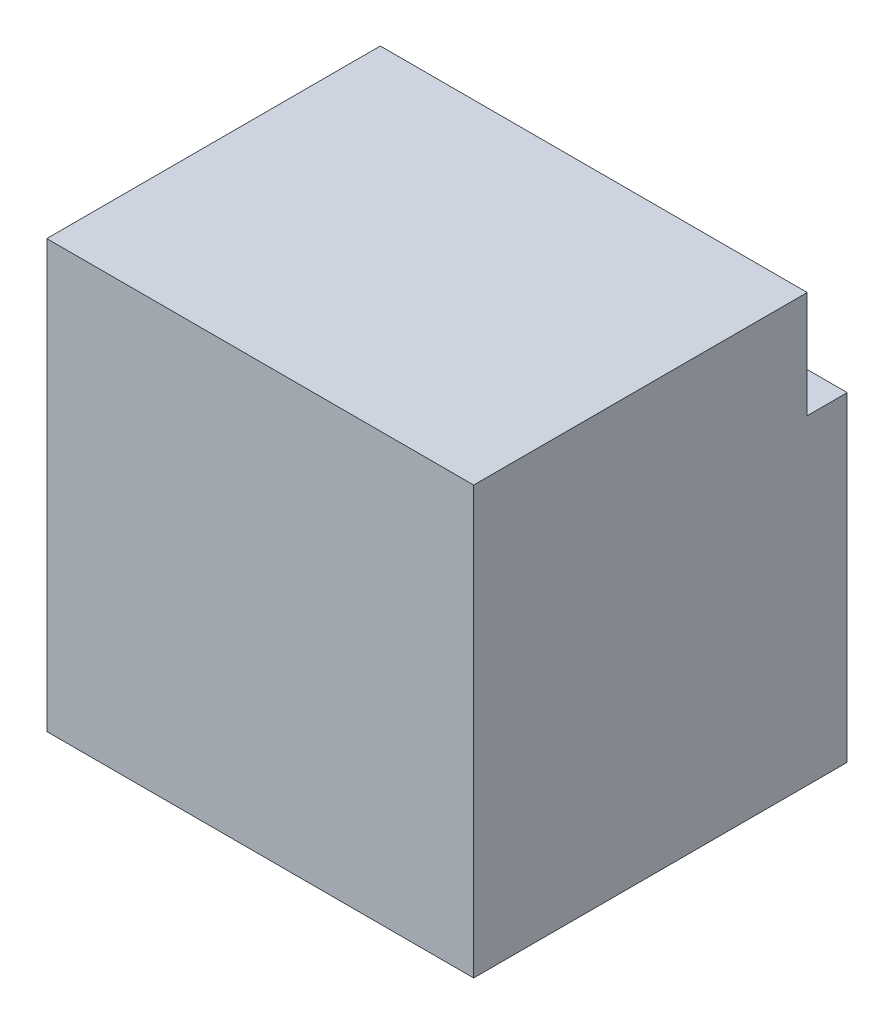
ISO-10303-21;
HEADER;
FILE_DESCRIPTION(('STEP AP214'),'2;1');
FILE_NAME('part.step','',(''),(''),'','','');
FILE_SCHEMA(('AUTOMOTIVE_DESIGN { 1 0 10303 214 1 1 1 1 }'));
ENDSEC;
DATA;
#1=APPLICATION_CONTEXT('core data for automotive mechanical design processes');
#2=APPLICATION_PROTOCOL_DEFINITION('international standard','automotive_design',2000,#1);
#3=PRODUCT_CONTEXT('',#1,'mechanical');
#4=PRODUCT('Part','Part','',(#3));
#5=PRODUCT_RELATED_PRODUCT_CATEGORY('part','',(#4));
#6=PRODUCT_DEFINITION_FORMATION('','',#4);
#7=PRODUCT_DEFINITION_CONTEXT('part definition',#1,'design');
#8=PRODUCT_DEFINITION('design','',#6,#7);
#9=PRODUCT_DEFINITION_SHAPE('','',#8);
#10=(LENGTH_UNIT() NAMED_UNIT(*) SI_UNIT(.MILLI.,.METRE.));
#11=(NAMED_UNIT(*) PLANE_ANGLE_UNIT() SI_UNIT($,.RADIAN.));
#12=(NAMED_UNIT(*) SI_UNIT($,.STERADIAN.) SOLID_ANGLE_UNIT());
#13=UNCERTAINTY_MEASURE_WITH_UNIT(LENGTH_MEASURE(1.E-05),#10,'distance_accuracy_value','');
#14=(GEOMETRIC_REPRESENTATION_CONTEXT(3) GLOBAL_UNCERTAINTY_ASSIGNED_CONTEXT((#13)) GLOBAL_UNIT_ASSIGNED_CONTEXT((#10,
#11,#12)) REPRESENTATION_CONTEXT('',''));
#15=CARTESIAN_POINT('',(0.,0.,0.));
#16=DIRECTION('',(0.,0.,1.));
#17=DIRECTION('',(1.,0.,0.));
#18=AXIS2_PLACEMENT_3D('',#15,#16,#17);
#19=CARTESIAN_POINT('',(-8.,8.,14.));
#20=DIRECTION('',(0.,-1.,0.));
#21=DIRECTION('',(0.,0.,-1.));
#22=AXIS2_PLACEMENT_3D('',#19,#20,#21);
#23=PLANE('',#22);
#24=DIRECTION('',(1.,0.,0.));
#25=VECTOR('',#24,1.);
#26=CARTESIAN_POINT('',(8.,8.,1.5));
#27=LINE('',#26,#25);
#28=CARTESIAN_POINT('',(-8.,8.,1.5));
#29=VERTEX_POINT('',#28);
#30=CARTESIAN_POINT('',(8.,8.,1.5));
#31=VERTEX_POINT('',#30);
#32=EDGE_CURVE('E379',#29,#31,#27,.T.);
#33=ORIENTED_EDGE('',*,*,#32,.F.);
#34=DIRECTION('',(0.,0.,-1.));
#35=VECTOR('',#34,1.);
#36=CARTESIAN_POINT('',(-8.,8.,14.));
#37=LINE('',#36,#35);
#38=CARTESIAN_POINT('',(-8.,8.,14.));
#39=VERTEX_POINT('',#38);
#40=EDGE_CURVE('E514',#39,#29,#37,.T.);
#41=ORIENTED_EDGE('',*,*,#40,.F.);
#42=DIRECTION('',(-1.,0.,0.));
#43=VECTOR('',#42,1.);
#44=CARTESIAN_POINT('',(-8.,8.,14.));
#45=LINE('',#44,#43);
#46=CARTESIAN_POINT('',(8.,8.,14.));
#47=VERTEX_POINT('',#46);
#48=EDGE_CURVE('E512',#47,#39,#45,.T.);
#49=ORIENTED_EDGE('',*,*,#48,.F.);
#50=DIRECTION('',(0.,0.,-1.));
#51=VECTOR('',#50,1.);
#52=CARTESIAN_POINT('',(8.,8.,14.));
#53=LINE('',#52,#51);
#54=EDGE_CURVE('E522',#47,#31,#53,.T.);
#55=ORIENTED_EDGE('',*,*,#54,.T.);
#56=EDGE_LOOP('',(#33,#41,#49,#55));
#57=FACE_BOUND('',#56,.T.);
#58=ADVANCED_FACE('F41',(#57),#23,.F.);
#59=CARTESIAN_POINT('',(-5.5,2.,10.));
#60=DIRECTION('',(0.,0.,1.));
#61=DIRECTION('',(1.,0.,0.));
#62=AXIS2_PLACEMENT_3D('',#59,#60,#61);
#63=PLANE('',#62);
#64=DIRECTION('',(-1.,0.,0.));
#65=VECTOR('',#64,1.);
#66=CARTESIAN_POINT('',(-5.5,2.,10.));
#67=LINE('',#66,#65);
#68=CARTESIAN_POINT('',(-3.5,2.,10.));
#69=VERTEX_POINT('',#68);
#70=CARTESIAN_POINT('',(-5.5,2.,10.));
#71=VERTEX_POINT('',#70);
#72=EDGE_CURVE('E479',#69,#71,#67,.T.);
#73=ORIENTED_EDGE('',*,*,#72,.F.);
#74=DIRECTION('',(0.,-1.,0.));
#75=VECTOR('',#74,1.);
#76=CARTESIAN_POINT('',(-3.5,2.,10.));
#77=LINE('',#76,#75);
#78=CARTESIAN_POINT('',(-3.5,-8.,10.));
#79=VERTEX_POINT('',#78);
#80=EDGE_CURVE('E453',#69,#79,#77,.T.);
#81=ORIENTED_EDGE('',*,*,#80,.T.);
#82=DIRECTION('',(-1.,0.,0.));
#83=VECTOR('',#82,1.);
#84=CARTESIAN_POINT('',(-5.5,-8.,10.));
#85=LINE('',#84,#83);
#86=CARTESIAN_POINT('',(-5.5,-8.,10.));
#87=VERTEX_POINT('',#86);
#88=EDGE_CURVE('E491',#79,#87,#85,.T.);
#89=ORIENTED_EDGE('',*,*,#88,.T.);
#90=DIRECTION('',(0.,-1.,0.));
#91=VECTOR('',#90,1.);
#92=CARTESIAN_POINT('',(-5.5,2.,10.));
#93=LINE('',#92,#91);
#94=EDGE_CURVE('E494',#71,#87,#93,.T.);
#95=ORIENTED_EDGE('',*,*,#94,.F.);
#96=EDGE_LOOP('',(#73,#81,#89,#95));
#97=FACE_BOUND('',#96,.T.);
#98=ADVANCED_FACE('F561',(#97),#63,.F.);
#99=CARTESIAN_POINT('',(-8.,8.,14.));
#100=DIRECTION('',(1.,0.,0.));
#101=DIRECTION('',(0.,1.,0.));
#102=AXIS2_PLACEMENT_3D('',#99,#100,#101);
#103=PLANE('',#102);
#104=DIRECTION('',(0.,1.,0.));
#105=VECTOR('',#104,1.);
#106=CARTESIAN_POINT('',(-8.,8.,1.5));
#107=LINE('',#106,#105);
#108=CARTESIAN_POINT('',(-8.,4.,1.5));
#109=VERTEX_POINT('',#108);
#110=EDGE_CURVE('E377',#109,#29,#107,.T.);
#111=ORIENTED_EDGE('',*,*,#110,.F.);
#112=DIRECTION('',(0.,0.,-1.));
#113=VECTOR('',#112,1.);
#114=CARTESIAN_POINT('',(-8.,4.,1.5));
#115=LINE('',#114,#113);
#116=CARTESIAN_POINT('',(-8.,4.,0.));
#117=VERTEX_POINT('',#116);
#118=EDGE_CURVE('E383',#109,#117,#115,.T.);
#119=ORIENTED_EDGE('',*,*,#118,.T.);
#120=DIRECTION('',(0.,-1.,0.));
#121=VECTOR('',#120,1.);
#122=CARTESIAN_POINT('',(-8.,8.,0.));
#123=LINE('',#122,#121);
#124=CARTESIAN_POINT('',(-8.,-8.,0.));
#125=VERTEX_POINT('',#124);
#126=EDGE_CURVE('E497',#117,#125,#123,.T.);
#127=ORIENTED_EDGE('',*,*,#126,.T.);
#128=DIRECTION('',(0.,0.,-1.));
#129=VECTOR('',#128,1.);
#130=CARTESIAN_POINT('',(-8.,-8.,14.));
#131=LINE('',#130,#129);
#132=CARTESIAN_POINT('',(-8.,-8.,14.));
#133=VERTEX_POINT('',#132);
#134=EDGE_CURVE('E11',#133,#125,#131,.T.);
#135=ORIENTED_EDGE('',*,*,#134,.F.);
#136=DIRECTION('',(0.,-1.,0.));
#137=VECTOR('',#136,1.);
#138=CARTESIAN_POINT('',(-8.,8.,14.));
#139=LINE('',#138,#137);
#140=EDGE_CURVE('E504',#39,#133,#139,.T.);
#141=ORIENTED_EDGE('',*,*,#140,.F.);
#142=ORIENTED_EDGE('',*,*,#40,.T.);
#143=EDGE_LOOP('',(#111,#119,#127,#135,#141,#142));
#144=FACE_BOUND('',#143,.T.);
#145=ADVANCED_FACE('F43',(#144),#103,.F.);
#146=CARTESIAN_POINT('',(-8.,-8.,14.));
#147=DIRECTION('',(0.,1.,0.));
#148=DIRECTION('',(0.,0.,1.));
#149=AXIS2_PLACEMENT_3D('',#146,#147,#148);
#150=PLANE('',#149);
#151=DIRECTION('',(1.,0.,0.));
#152=VECTOR('',#151,1.);
#153=CARTESIAN_POINT('',(4.1,-8.,10.6));
#154=LINE('',#153,#152);
#155=CARTESIAN_POINT('',(4.1,-8.,10.6));
#156=VERTEX_POINT('',#155);
#157=CARTESIAN_POINT('',(6.1,-8.,10.6));
#158=VERTEX_POINT('',#157);
#159=EDGE_CURVE('E400',#156,#158,#154,.T.);
#160=ORIENTED_EDGE('',*,*,#159,.F.);
#161=DIRECTION('',(0.,0.,-1.));
#162=VECTOR('',#161,1.);
#163=CARTESIAN_POINT('',(4.1,-8.,12.2));
#164=LINE('',#163,#162);
#165=CARTESIAN_POINT('',(4.1,-8.,12.2));
#166=VERTEX_POINT('',#165);
#167=EDGE_CURVE('E398',#166,#156,#164,.T.);
#168=ORIENTED_EDGE('',*,*,#167,.F.);
#169=DIRECTION('',(-1.,0.,0.));
#170=VECTOR('',#169,1.);
#171=CARTESIAN_POINT('',(4.1,-8.,12.2));
#172=LINE('',#171,#170);
#173=CARTESIAN_POINT('',(6.1,-8.,12.2));
#174=VERTEX_POINT('',#173);
#175=EDGE_CURVE('E392',#174,#166,#172,.T.);
#176=ORIENTED_EDGE('',*,*,#175,.F.);
#177=DIRECTION('',(0.,0.,1.));
#178=VECTOR('',#177,1.);
#179=CARTESIAN_POINT('',(6.1,-8.,12.2));
#180=LINE('',#179,#178);
#181=EDGE_CURVE('E404',#158,#174,#180,.T.);
#182=ORIENTED_EDGE('',*,*,#181,.F.);
#183=EDGE_LOOP('',(#160,#168,#176,#182));
#184=FACE_BOUND('',#183,.T.);
#185=DIRECTION('',(1.,0.,0.));
#186=VECTOR('',#185,1.);
#187=CARTESIAN_POINT('',(-6.1,-8.,10.6));
#188=LINE('',#187,#186);
#189=CARTESIAN_POINT('',(-6.1,-8.,10.6));
#190=VERTEX_POINT('',#189);
#191=CARTESIAN_POINT('',(-4.1,-8.,10.6));
#192=VERTEX_POINT('',#191);
#193=EDGE_CURVE('E433',#190,#192,#188,.T.);
#194=ORIENTED_EDGE('',*,*,#193,.F.);
#195=DIRECTION('',(0.,0.,-1.));
#196=VECTOR('',#195,1.);
#197=CARTESIAN_POINT('',(-6.1,-8.,12.2));
#198=LINE('',#197,#196);
#199=CARTESIAN_POINT('',(-6.1,-8.,12.2));
#200=VERTEX_POINT('',#199);
#201=EDGE_CURVE('E401',#200,#190,#198,.T.);
#202=ORIENTED_EDGE('',*,*,#201,.F.);
#203=DIRECTION('',(-1.,0.,0.));
#204=VECTOR('',#203,1.);
#205=CARTESIAN_POINT('',(-6.1,-8.,12.2));
#206=LINE('',#205,#204);
#207=CARTESIAN_POINT('',(-4.1,-8.,12.2));
#208=VERTEX_POINT('',#207);
#209=EDGE_CURVE('E426',#208,#200,#206,.T.);
#210=ORIENTED_EDGE('',*,*,#209,.F.);
#211=DIRECTION('',(0.,0.,1.));
#212=VECTOR('',#211,1.);
#213=CARTESIAN_POINT('',(-4.1,-8.,12.2));
#214=LINE('',#213,#212);
#215=EDGE_CURVE('E429',#192,#208,#214,.T.);
#216=ORIENTED_EDGE('',*,*,#215,.F.);
#217=EDGE_LOOP('',(#194,#202,#210,#216));
#218=FACE_BOUND('',#217,.T.);
#219=ORIENTED_EDGE('',*,*,#88,.F.);
#220=DIRECTION('',(0.,0.,-1.));
#221=VECTOR('',#220,1.);
#222=CARTESIAN_POINT('',(-3.5,-8.,12.));
#223=LINE('',#222,#221);
#224=CARTESIAN_POINT('',(-3.5,-8.,12.));
#225=VERTEX_POINT('',#224);
#226=EDGE_CURVE('E411',#225,#79,#223,.T.);
#227=ORIENTED_EDGE('',*,*,#226,.F.);
#228=DIRECTION('',(-1.,0.,0.));
#229=VECTOR('',#228,1.);
#230=CARTESIAN_POINT('',(-3.5,-8.,12.));
#231=LINE('',#230,#229);
#232=CARTESIAN_POINT('',(3.5,-8.,12.));
#233=VERTEX_POINT('',#232);
#234=EDGE_CURVE('E447',#233,#225,#231,.T.);
#235=ORIENTED_EDGE('',*,*,#234,.F.);
#236=DIRECTION('',(0.,0.,1.));
#237=VECTOR('',#236,1.);
#238=CARTESIAN_POINT('',(3.5,-8.,12.));
#239=LINE('',#238,#237);
#240=CARTESIAN_POINT('',(3.5,-8.,10.));
#241=VERTEX_POINT('',#240);
#242=EDGE_CURVE('E455',#241,#233,#239,.T.);
#243=ORIENTED_EDGE('',*,*,#242,.F.);
#244=CARTESIAN_POINT('',(5.5,-8.,10.));
#245=VERTEX_POINT('',#244);
#246=EDGE_CURVE('E473',#245,#241,#85,.T.);
#247=ORIENTED_EDGE('',*,*,#246,.F.);
#248=DIRECTION('',(0.,0.,1.));
#249=VECTOR('',#248,1.);
#250=CARTESIAN_POINT('',(5.5,-8.,10.));
#251=LINE('',#250,#249);
#252=CARTESIAN_POINT('',(5.5,-8.,3.));
#253=VERTEX_POINT('',#252);
#254=EDGE_CURVE('E488',#253,#245,#251,.T.);
#255=ORIENTED_EDGE('',*,*,#254,.F.);
#256=DIRECTION('',(1.,0.,0.));
#257=VECTOR('',#256,1.);
#258=CARTESIAN_POINT('',(-5.5,-8.,3.));
#259=LINE('',#258,#257);
#260=CARTESIAN_POINT('',(-5.5,-8.,3.));
#261=VERTEX_POINT('',#260);
#262=EDGE_CURVE('E485',#261,#253,#259,.T.);
#263=ORIENTED_EDGE('',*,*,#262,.F.);
#264=DIRECTION('',(0.,0.,-1.));
#265=VECTOR('',#264,1.);
#266=CARTESIAN_POINT('',(-5.5,-8.,10.));
#267=LINE('',#266,#265);
#268=EDGE_CURVE('E462',#87,#261,#267,.T.);
#269=ORIENTED_EDGE('',*,*,#268,.F.);
#270=EDGE_LOOP('',(#219,#227,#235,#243,#247,#255,#263,#269));
#271=FACE_BOUND('',#270,.T.);
#272=DIRECTION('',(1.,0.,0.));
#273=VECTOR('',#272,1.);
#274=CARTESIAN_POINT('',(-8.,-8.,0.));
#275=LINE('',#274,#273);
#276=CARTESIAN_POINT('',(8.,-8.,0.));
#277=VERTEX_POINT('',#276);
#278=EDGE_CURVE('E516',#125,#277,#275,.T.);
#279=ORIENTED_EDGE('',*,*,#278,.T.);
#280=DIRECTION('',(0.,0.,-1.));
#281=VECTOR('',#280,1.);
#282=CARTESIAN_POINT('',(8.,-8.,14.));
#283=LINE('',#282,#281);
#284=CARTESIAN_POINT('',(8.,-8.,14.));
#285=VERTEX_POINT('',#284);
#286=EDGE_CURVE('E49',#285,#277,#283,.T.);
#287=ORIENTED_EDGE('',*,*,#286,.F.);
#288=DIRECTION('',(1.,0.,0.));
#289=VECTOR('',#288,1.);
#290=CARTESIAN_POINT('',(-8.,-8.,14.));
#291=LINE('',#290,#289);
#292=EDGE_CURVE('E507',#133,#285,#291,.T.);
#293=ORIENTED_EDGE('',*,*,#292,.F.);
#294=ORIENTED_EDGE('',*,*,#134,.T.);
#295=EDGE_LOOP('',(#279,#287,#293,#294));
#296=FACE_BOUND('',#295,.T.);
#297=ADVANCED_FACE('F553',(#184,#218,#271,#296),#150,.F.);
#298=CARTESIAN_POINT('',(8.,8.,14.));
#299=DIRECTION('',(-1.,0.,0.));
#300=DIRECTION('',(0.,-1.,0.));
#301=AXIS2_PLACEMENT_3D('',#298,#299,#300);
#302=PLANE('',#301);
#303=DIRECTION('',(0.,1.,0.));
#304=VECTOR('',#303,1.);
#305=CARTESIAN_POINT('',(8.,8.,0.));
#306=LINE('',#305,#304);
#307=CARTESIAN_POINT('',(8.,4.,0.));
#308=VERTEX_POINT('',#307);
#309=EDGE_CURVE('E508',#277,#308,#306,.T.);
#310=ORIENTED_EDGE('',*,*,#309,.T.);
#311=DIRECTION('',(0.,0.,-1.));
#312=VECTOR('',#311,1.);
#313=CARTESIAN_POINT('',(8.,4.,1.5));
#314=LINE('',#313,#312);
#315=CARTESIAN_POINT('',(8.,4.,1.5));
#316=VERTEX_POINT('',#315);
#317=EDGE_CURVE('E381',#316,#308,#314,.T.);
#318=ORIENTED_EDGE('',*,*,#317,.F.);
#319=DIRECTION('',(0.,-1.,0.));
#320=VECTOR('',#319,1.);
#321=CARTESIAN_POINT('',(8.,8.,1.5));
#322=LINE('',#321,#320);
#323=EDGE_CURVE('E371',#31,#316,#322,.T.);
#324=ORIENTED_EDGE('',*,*,#323,.F.);
#325=ORIENTED_EDGE('',*,*,#54,.F.);
#326=DIRECTION('',(0.,1.,0.));
#327=VECTOR('',#326,1.);
#328=CARTESIAN_POINT('',(8.,8.,14.));
#329=LINE('',#328,#327);
#330=EDGE_CURVE('E510',#285,#47,#329,.T.);
#331=ORIENTED_EDGE('',*,*,#330,.F.);
#332=ORIENTED_EDGE('',*,*,#286,.T.);
#333=EDGE_LOOP('',(#310,#318,#324,#325,#331,#332));
#334=FACE_BOUND('',#333,.T.);
#335=ADVANCED_FACE('F529',(#334),#302,.F.);
#336=CARTESIAN_POINT('',(0.,0.,14.));
#337=DIRECTION('',(0.,0.,1.));
#338=DIRECTION('',(1.,0.,0.));
#339=AXIS2_PLACEMENT_3D('',#336,#337,#338);
#340=PLANE('',#339);
#341=ORIENTED_EDGE('',*,*,#140,.T.);
#342=ORIENTED_EDGE('',*,*,#292,.T.);
#343=ORIENTED_EDGE('',*,*,#330,.T.);
#344=ORIENTED_EDGE('',*,*,#48,.T.);
#345=EDGE_LOOP('',(#341,#342,#343,#344));
#346=FACE_BOUND('',#345,.T.);
#347=ADVANCED_FACE('F552',(#346),#340,.T.);
#348=CARTESIAN_POINT('',(0.,0.,0.));
#349=DIRECTION('',(0.,0.,1.));
#350=DIRECTION('',(1.,0.,0.));
#351=AXIS2_PLACEMENT_3D('',#348,#349,#350);
#352=PLANE('',#351);
#353=ORIENTED_EDGE('',*,*,#126,.F.);
#354=DIRECTION('',(-1.,0.,0.));
#355=VECTOR('',#354,1.);
#356=CARTESIAN_POINT('',(8.,4.,0.));
#357=LINE('',#356,#355);
#358=EDGE_CURVE('E370',#308,#117,#357,.T.);
#359=ORIENTED_EDGE('',*,*,#358,.F.);
#360=ORIENTED_EDGE('',*,*,#309,.F.);
#361=ORIENTED_EDGE('',*,*,#278,.F.);
#362=EDGE_LOOP('',(#353,#359,#360,#361));
#363=FACE_BOUND('',#362,.T.);
#364=ADVANCED_FACE('F537',(#363),#352,.F.);
#365=CARTESIAN_POINT('',(-5.5,2.,10.));
#366=DIRECTION('',(-1.,0.,0.));
#367=DIRECTION('',(0.,0.,1.));
#368=AXIS2_PLACEMENT_3D('',#365,#366,#367);
#369=PLANE('',#368);
#370=ORIENTED_EDGE('',*,*,#268,.T.);
#371=DIRECTION('',(0.,-1.,0.));
#372=VECTOR('',#371,1.);
#373=CARTESIAN_POINT('',(-5.5,2.,3.));
#374=LINE('',#373,#372);
#375=CARTESIAN_POINT('',(-5.5,2.,3.));
#376=VERTEX_POINT('',#375);
#377=EDGE_CURVE('E483',#376,#261,#374,.T.);
#378=ORIENTED_EDGE('',*,*,#377,.F.);
#379=DIRECTION('',(0.,0.,-1.));
#380=VECTOR('',#379,1.);
#381=CARTESIAN_POINT('',(-5.5,2.,10.));
#382=LINE('',#381,#380);
#383=EDGE_CURVE('E469',#71,#376,#382,.T.);
#384=ORIENTED_EDGE('',*,*,#383,.F.);
#385=ORIENTED_EDGE('',*,*,#94,.T.);
#386=EDGE_LOOP('',(#370,#378,#384,#385));
#387=FACE_BOUND('',#386,.T.);
#388=ADVANCED_FACE('F575',(#387),#369,.F.);
#389=ORIENTED_EDGE('',*,*,#246,.T.);
#390=DIRECTION('',(0.,-1.,0.));
#391=VECTOR('',#390,1.);
#392=CARTESIAN_POINT('',(3.5,2.,10.));
#393=LINE('',#392,#391);
#394=CARTESIAN_POINT('',(3.5,2.,10.));
#395=VERTEX_POINT('',#394);
#396=EDGE_CURVE('E465',#395,#241,#393,.T.);
#397=ORIENTED_EDGE('',*,*,#396,.F.);
#398=CARTESIAN_POINT('',(5.5,2.,10.));
#399=VERTEX_POINT('',#398);
#400=EDGE_CURVE('E480',#399,#395,#67,.T.);
#401=ORIENTED_EDGE('',*,*,#400,.F.);
#402=DIRECTION('',(0.,-1.,0.));
#403=VECTOR('',#402,1.);
#404=CARTESIAN_POINT('',(5.5,2.,10.));
#405=LINE('',#404,#403);
#406=EDGE_CURVE('E498',#399,#245,#405,.T.);
#407=ORIENTED_EDGE('',*,*,#406,.T.);
#408=EDGE_LOOP('',(#389,#397,#401,#407));
#409=FACE_BOUND('',#408,.T.);
#410=ADVANCED_FACE('F571',(#409),#63,.F.);
#411=CARTESIAN_POINT('',(5.5,2.,10.));
#412=DIRECTION('',(1.,0.,0.));
#413=DIRECTION('',(0.,0.,-1.));
#414=AXIS2_PLACEMENT_3D('',#411,#412,#413);
#415=PLANE('',#414);
#416=ORIENTED_EDGE('',*,*,#254,.T.);
#417=ORIENTED_EDGE('',*,*,#406,.F.);
#418=DIRECTION('',(0.,0.,1.));
#419=VECTOR('',#418,1.);
#420=CARTESIAN_POINT('',(5.5,2.,10.));
#421=LINE('',#420,#419);
#422=CARTESIAN_POINT('',(5.5,2.,3.));
#423=VERTEX_POINT('',#422);
#424=EDGE_CURVE('E476',#423,#399,#421,.T.);
#425=ORIENTED_EDGE('',*,*,#424,.F.);
#426=DIRECTION('',(0.,-1.,0.));
#427=VECTOR('',#426,1.);
#428=CARTESIAN_POINT('',(5.5,2.,3.));
#429=LINE('',#428,#427);
#430=EDGE_CURVE('E500',#423,#253,#429,.T.);
#431=ORIENTED_EDGE('',*,*,#430,.T.);
#432=EDGE_LOOP('',(#416,#417,#425,#431));
#433=FACE_BOUND('',#432,.T.);
#434=ADVANCED_FACE('F585',(#433),#415,.F.);
#435=CARTESIAN_POINT('',(-5.5,2.,3.));
#436=DIRECTION('',(0.,0.,-1.));
#437=DIRECTION('',(-1.,0.,0.));
#438=AXIS2_PLACEMENT_3D('',#435,#436,#437);
#439=PLANE('',#438);
#440=ORIENTED_EDGE('',*,*,#262,.T.);
#441=ORIENTED_EDGE('',*,*,#430,.F.);
#442=DIRECTION('',(1.,0.,0.));
#443=VECTOR('',#442,1.);
#444=CARTESIAN_POINT('',(-5.5,2.,3.));
#445=LINE('',#444,#443);
#446=EDGE_CURVE('E472',#376,#423,#445,.T.);
#447=ORIENTED_EDGE('',*,*,#446,.F.);
#448=ORIENTED_EDGE('',*,*,#377,.T.);
#449=EDGE_LOOP('',(#440,#441,#447,#448));
#450=FACE_BOUND('',#449,.T.);
#451=ADVANCED_FACE('F581',(#450),#439,.F.);
#452=CARTESIAN_POINT('',(0.,2.,0.));
#453=DIRECTION('',(0.,-1.,0.));
#454=DIRECTION('',(0.,0.,-1.));
#455=AXIS2_PLACEMENT_3D('',#452,#453,#454);
#456=PLANE('',#455);
#457=ORIENTED_EDGE('',*,*,#383,.T.);
#458=ORIENTED_EDGE('',*,*,#446,.T.);
#459=ORIENTED_EDGE('',*,*,#424,.T.);
#460=ORIENTED_EDGE('',*,*,#400,.T.);
#461=DIRECTION('',(0.,0.,1.));
#462=VECTOR('',#461,1.);
#463=CARTESIAN_POINT('',(3.5,2.,12.));
#464=LINE('',#463,#462);
#465=CARTESIAN_POINT('',(3.5,2.,12.));
#466=VERTEX_POINT('',#465);
#467=EDGE_CURVE('E446',#395,#466,#464,.T.);
#468=ORIENTED_EDGE('',*,*,#467,.T.);
#469=DIRECTION('',(-1.,0.,0.));
#470=VECTOR('',#469,1.);
#471=CARTESIAN_POINT('',(-3.5,2.,12.));
#472=LINE('',#471,#470);
#473=CARTESIAN_POINT('',(-3.5,2.,12.));
#474=VERTEX_POINT('',#473);
#475=EDGE_CURVE('E450',#466,#474,#472,.T.);
#476=ORIENTED_EDGE('',*,*,#475,.T.);
#477=DIRECTION('',(0.,0.,-1.));
#478=VECTOR('',#477,1.);
#479=CARTESIAN_POINT('',(-3.5,2.,12.));
#480=LINE('',#479,#478);
#481=EDGE_CURVE('E444',#474,#69,#480,.T.);
#482=ORIENTED_EDGE('',*,*,#481,.T.);
#483=ORIENTED_EDGE('',*,*,#72,.T.);
#484=EDGE_LOOP('',(#457,#458,#459,#460,#468,#476,#482,#483));
#485=FACE_BOUND('',#484,.T.);
#486=ADVANCED_FACE('F584',(#485),#456,.T.);
#487=CARTESIAN_POINT('',(-3.5,2.,12.));
#488=DIRECTION('',(-1.,0.,0.));
#489=DIRECTION('',(0.,0.,1.));
#490=AXIS2_PLACEMENT_3D('',#487,#488,#489);
#491=PLANE('',#490);
#492=ORIENTED_EDGE('',*,*,#226,.T.);
#493=ORIENTED_EDGE('',*,*,#80,.F.);
#494=ORIENTED_EDGE('',*,*,#481,.F.);
#495=DIRECTION('',(0.,-1.,0.));
#496=VECTOR('',#495,1.);
#497=CARTESIAN_POINT('',(-3.5,2.,12.));
#498=LINE('',#497,#496);
#499=EDGE_CURVE('E460',#474,#225,#498,.T.);
#500=ORIENTED_EDGE('',*,*,#499,.T.);
#501=EDGE_LOOP('',(#492,#493,#494,#500));
#502=FACE_BOUND('',#501,.T.);
#503=ADVANCED_FACE('F594',(#502),#491,.F.);
#504=CARTESIAN_POINT('',(-3.5,2.,12.));
#505=DIRECTION('',(0.,0.,1.));
#506=DIRECTION('',(1.,0.,0.));
#507=AXIS2_PLACEMENT_3D('',#504,#505,#506);
#508=PLANE('',#507);
#509=ORIENTED_EDGE('',*,*,#234,.T.);
#510=ORIENTED_EDGE('',*,*,#499,.F.);
#511=ORIENTED_EDGE('',*,*,#475,.F.);
#512=DIRECTION('',(0.,-1.,0.));
#513=VECTOR('',#512,1.);
#514=CARTESIAN_POINT('',(3.5,2.,12.));
#515=LINE('',#514,#513);
#516=EDGE_CURVE('E463',#466,#233,#515,.T.);
#517=ORIENTED_EDGE('',*,*,#516,.T.);
#518=EDGE_LOOP('',(#509,#510,#511,#517));
#519=FACE_BOUND('',#518,.T.);
#520=ADVANCED_FACE('F598',(#519),#508,.F.);
#521=CARTESIAN_POINT('',(3.5,2.,12.));
#522=DIRECTION('',(1.,0.,0.));
#523=DIRECTION('',(0.,0.,-1.));
#524=AXIS2_PLACEMENT_3D('',#521,#522,#523);
#525=PLANE('',#524);
#526=ORIENTED_EDGE('',*,*,#242,.T.);
#527=ORIENTED_EDGE('',*,*,#516,.F.);
#528=ORIENTED_EDGE('',*,*,#467,.F.);
#529=ORIENTED_EDGE('',*,*,#396,.T.);
#530=EDGE_LOOP('',(#526,#527,#528,#529));
#531=FACE_BOUND('',#530,.T.);
#532=ADVANCED_FACE('F600',(#531),#525,.F.);
#533=CARTESIAN_POINT('',(-6.1,7.,12.2));
#534=DIRECTION('',(-1.,0.,0.));
#535=DIRECTION('',(0.,0.,1.));
#536=AXIS2_PLACEMENT_3D('',#533,#534,#535);
#537=PLANE('',#536);
#538=DIRECTION('',(0.,-1.,0.));
#539=VECTOR('',#538,1.);
#540=CARTESIAN_POINT('',(-6.1,7.,10.6));
#541=LINE('',#540,#539);
#542=CARTESIAN_POINT('',(-6.1,5.5,10.6));
#543=VERTEX_POINT('',#542);
#544=EDGE_CURVE('E418',#543,#190,#541,.T.);
#545=ORIENTED_EDGE('',*,*,#544,.F.);
#546=DIRECTION('',(0.,0.,1.));
#547=VECTOR('',#546,1.);
#548=CARTESIAN_POINT('',(-6.1,5.5,12.2));
#549=LINE('',#548,#547);
#550=CARTESIAN_POINT('',(-6.1,5.5,12.2));
#551=VERTEX_POINT('',#550);
#552=EDGE_CURVE('E343',#543,#551,#549,.T.);
#553=ORIENTED_EDGE('',*,*,#552,.T.);
#554=DIRECTION('',(0.,-1.,0.));
#555=VECTOR('',#554,1.);
#556=CARTESIAN_POINT('',(-6.1,7.,12.2));
#557=LINE('',#556,#555);
#558=EDGE_CURVE('E386',#551,#200,#557,.T.);
#559=ORIENTED_EDGE('',*,*,#558,.T.);
#560=ORIENTED_EDGE('',*,*,#201,.T.);
#561=EDGE_LOOP('',(#545,#553,#559,#560));
#562=FACE_BOUND('',#561,.T.);
#563=ADVANCED_FACE('F603',(#562),#537,.F.);
#564=CARTESIAN_POINT('',(-6.1,7.,12.2));
#565=DIRECTION('',(0.,0.,1.));
#566=DIRECTION('',(1.,0.,0.));
#567=AXIS2_PLACEMENT_3D('',#564,#565,#566);
#568=PLANE('',#567);
#569=DIRECTION('',(1.,0.,0.));
#570=VECTOR('',#569,1.);
#571=CARTESIAN_POINT('',(-6.1,5.5,12.2));
#572=LINE('',#571,#570);
#573=CARTESIAN_POINT('',(-4.5,5.5,12.2));
#574=VERTEX_POINT('',#573);
#575=EDGE_CURVE('E346',#551,#574,#572,.T.);
#576=ORIENTED_EDGE('',*,*,#575,.T.);
#577=DIRECTION('',(0.,1.,0.));
#578=VECTOR('',#577,1.);
#579=CARTESIAN_POINT('',(-4.5,7.,12.2));
#580=LINE('',#579,#578);
#581=CARTESIAN_POINT('',(-4.5,7.,12.2));
#582=VERTEX_POINT('',#581);
#583=EDGE_CURVE('E352',#574,#582,#580,.T.);
#584=ORIENTED_EDGE('',*,*,#583,.T.);
#585=DIRECTION('',(-1.,0.,0.));
#586=VECTOR('',#585,1.);
#587=CARTESIAN_POINT('',(-6.1,7.,12.2));
#588=LINE('',#587,#586);
#589=CARTESIAN_POINT('',(-4.1,7.,12.2));
#590=VERTEX_POINT('',#589);
#591=EDGE_CURVE('E420',#590,#582,#588,.T.);
#592=ORIENTED_EDGE('',*,*,#591,.F.);
#593=DIRECTION('',(0.,-1.,0.));
#594=VECTOR('',#593,1.);
#595=CARTESIAN_POINT('',(-4.1,7.,12.2));
#596=LINE('',#595,#594);
#597=EDGE_CURVE('E423',#590,#208,#596,.T.);
#598=ORIENTED_EDGE('',*,*,#597,.T.);
#599=ORIENTED_EDGE('',*,*,#209,.T.);
#600=ORIENTED_EDGE('',*,*,#558,.F.);
#601=EDGE_LOOP('',(#576,#584,#592,#598,#599,#600));
#602=FACE_BOUND('',#601,.T.);
#603=ADVANCED_FACE('F614',(#602),#568,.F.);
#604=CARTESIAN_POINT('',(-4.1,7.,12.2));
#605=DIRECTION('',(1.,0.,0.));
#606=DIRECTION('',(0.,0.,-1.));
#607=AXIS2_PLACEMENT_3D('',#604,#605,#606);
#608=PLANE('',#607);
#609=ORIENTED_EDGE('',*,*,#215,.T.);
#610=ORIENTED_EDGE('',*,*,#597,.F.);
#611=DIRECTION('',(0.,0.,1.));
#612=VECTOR('',#611,1.);
#613=CARTESIAN_POINT('',(-4.1,7.,12.2));
#614=LINE('',#613,#612);
#615=CARTESIAN_POINT('',(-4.1,7.,10.6));
#616=VERTEX_POINT('',#615);
#617=EDGE_CURVE('E440',#616,#590,#614,.T.);
#618=ORIENTED_EDGE('',*,*,#617,.F.);
#619=DIRECTION('',(0.,-1.,0.));
#620=VECTOR('',#619,1.);
#621=CARTESIAN_POINT('',(-4.1,7.,10.6));
#622=LINE('',#621,#620);
#623=EDGE_CURVE('E421',#616,#192,#622,.T.);
#624=ORIENTED_EDGE('',*,*,#623,.T.);
#625=EDGE_LOOP('',(#609,#610,#618,#624));
#626=FACE_BOUND('',#625,.T.);
#627=ADVANCED_FACE('F617',(#626),#608,.F.);
#628=CARTESIAN_POINT('',(-6.1,7.,10.6));
#629=DIRECTION('',(0.,0.,-1.));
#630=DIRECTION('',(-1.,0.,0.));
#631=AXIS2_PLACEMENT_3D('',#628,#629,#630);
#632=PLANE('',#631);
#633=DIRECTION('',(1.,0.,0.));
#634=VECTOR('',#633,1.);
#635=CARTESIAN_POINT('',(-6.1,7.,10.6));
#636=LINE('',#635,#634);
#637=CARTESIAN_POINT('',(-4.5,7.,10.6));
#638=VERTEX_POINT('',#637);
#639=EDGE_CURVE('E430',#638,#616,#636,.T.);
#640=ORIENTED_EDGE('',*,*,#639,.F.);
#641=DIRECTION('',(0.,-1.,0.));
#642=VECTOR('',#641,1.);
#643=CARTESIAN_POINT('',(-4.5,7.,10.6));
#644=LINE('',#643,#642);
#645=CARTESIAN_POINT('',(-4.5,5.5,10.6));
#646=VERTEX_POINT('',#645);
#647=EDGE_CURVE('E56',#638,#646,#644,.T.);
#648=ORIENTED_EDGE('',*,*,#647,.T.);
#649=DIRECTION('',(-1.,0.,0.));
#650=VECTOR('',#649,1.);
#651=CARTESIAN_POINT('',(-6.1,5.5,10.6));
#652=LINE('',#651,#650);
#653=EDGE_CURVE('E305',#646,#543,#652,.T.);
#654=ORIENTED_EDGE('',*,*,#653,.T.);
#655=ORIENTED_EDGE('',*,*,#544,.T.);
#656=ORIENTED_EDGE('',*,*,#193,.T.);
#657=ORIENTED_EDGE('',*,*,#623,.F.);
#658=EDGE_LOOP('',(#640,#648,#654,#655,#656,#657));
#659=FACE_BOUND('',#658,.T.);
#660=ADVANCED_FACE('F612',(#659),#632,.F.);
#661=CARTESIAN_POINT('',(0.,7.,0.));
#662=DIRECTION('',(0.,-1.,0.));
#663=DIRECTION('',(0.,0.,-1.));
#664=AXIS2_PLACEMENT_3D('',#661,#662,#663);
#665=PLANE('',#664);
#666=DIRECTION('',(0.,0.,1.));
#667=VECTOR('',#666,1.);
#668=CARTESIAN_POINT('',(-4.5,7.,0.));
#669=LINE('',#668,#667);
#670=EDGE_CURVE('E349',#638,#582,#669,.T.);
#671=ORIENTED_EDGE('',*,*,#670,.F.);
#672=ORIENTED_EDGE('',*,*,#639,.T.);
#673=ORIENTED_EDGE('',*,*,#617,.T.);
#674=ORIENTED_EDGE('',*,*,#591,.T.);
#675=EDGE_LOOP('',(#671,#672,#673,#674));
#676=FACE_BOUND('',#675,.T.);
#677=ADVANCED_FACE('F608',(#676),#665,.T.);
#678=CARTESIAN_POINT('',(4.1,7.,12.2));
#679=DIRECTION('',(-1.,0.,0.));
#680=DIRECTION('',(0.,0.,1.));
#681=AXIS2_PLACEMENT_3D('',#678,#679,#680);
#682=PLANE('',#681);
#683=ORIENTED_EDGE('',*,*,#167,.T.);
#684=DIRECTION('',(0.,-1.,0.));
#685=VECTOR('',#684,1.);
#686=CARTESIAN_POINT('',(4.1,7.,10.6));
#687=LINE('',#686,#685);
#688=CARTESIAN_POINT('',(4.1,7.,10.6));
#689=VERTEX_POINT('',#688);
#690=EDGE_CURVE('E397',#689,#156,#687,.T.);
#691=ORIENTED_EDGE('',*,*,#690,.F.);
#692=DIRECTION('',(0.,0.,-1.));
#693=VECTOR('',#692,1.);
#694=CARTESIAN_POINT('',(4.1,7.,12.2));
#695=LINE('',#694,#693);
#696=CARTESIAN_POINT('',(4.1,7.,12.2));
#697=VERTEX_POINT('',#696);
#698=EDGE_CURVE('E388',#697,#689,#695,.T.);
#699=ORIENTED_EDGE('',*,*,#698,.F.);
#700=DIRECTION('',(0.,-1.,0.));
#701=VECTOR('',#700,1.);
#702=CARTESIAN_POINT('',(4.1,7.,12.2));
#703=LINE('',#702,#701);
#704=EDGE_CURVE('E409',#697,#166,#703,.T.);
#705=ORIENTED_EDGE('',*,*,#704,.T.);
#706=EDGE_LOOP('',(#683,#691,#699,#705));
#707=FACE_BOUND('',#706,.T.);
#708=ADVANCED_FACE('F611',(#707),#682,.F.);
#709=CARTESIAN_POINT('',(4.1,7.,12.2));
#710=DIRECTION('',(0.,0.,1.));
#711=DIRECTION('',(1.,0.,0.));
#712=AXIS2_PLACEMENT_3D('',#709,#710,#711);
#713=PLANE('',#712);
#714=DIRECTION('',(-1.,0.,0.));
#715=VECTOR('',#714,1.);
#716=CARTESIAN_POINT('',(4.1,7.,12.2));
#717=LINE('',#716,#715);
#718=CARTESIAN_POINT('',(4.5,7.,12.2));
#719=VERTEX_POINT('',#718);
#720=EDGE_CURVE('E395',#719,#697,#717,.T.);
#721=ORIENTED_EDGE('',*,*,#720,.F.);
#722=DIRECTION('',(0.,-1.,0.));
#723=VECTOR('',#722,1.);
#724=CARTESIAN_POINT('',(4.5,7.,12.2));
#725=LINE('',#724,#723);
#726=CARTESIAN_POINT('',(4.5,5.5,12.2));
#727=VERTEX_POINT('',#726);
#728=EDGE_CURVE('E64',#719,#727,#725,.T.);
#729=ORIENTED_EDGE('',*,*,#728,.T.);
#730=DIRECTION('',(1.,0.,0.));
#731=VECTOR('',#730,1.);
#732=CARTESIAN_POINT('',(4.1,5.5,12.2));
#733=LINE('',#732,#731);
#734=CARTESIAN_POINT('',(6.1,5.5,12.2));
#735=VERTEX_POINT('',#734);
#736=EDGE_CURVE('E361',#727,#735,#733,.T.);
#737=ORIENTED_EDGE('',*,*,#736,.T.);
#738=DIRECTION('',(0.,-1.,0.));
#739=VECTOR('',#738,1.);
#740=CARTESIAN_POINT('',(6.1,7.,12.2));
#741=LINE('',#740,#739);
#742=EDGE_CURVE('E412',#735,#174,#741,.T.);
#743=ORIENTED_EDGE('',*,*,#742,.T.);
#744=ORIENTED_EDGE('',*,*,#175,.T.);
#745=ORIENTED_EDGE('',*,*,#704,.F.);
#746=EDGE_LOOP('',(#721,#729,#737,#743,#744,#745));
#747=FACE_BOUND('',#746,.T.);
#748=ADVANCED_FACE('F630',(#747),#713,.F.);
#749=CARTESIAN_POINT('',(6.1,7.,12.2));
#750=DIRECTION('',(1.,0.,0.));
#751=DIRECTION('',(0.,0.,-1.));
#752=AXIS2_PLACEMENT_3D('',#749,#750,#751);
#753=PLANE('',#752);
#754=ORIENTED_EDGE('',*,*,#742,.F.);
#755=DIRECTION('',(0.,0.,-1.));
#756=VECTOR('',#755,1.);
#757=CARTESIAN_POINT('',(6.1,5.5,12.2));
#758=LINE('',#757,#756);
#759=CARTESIAN_POINT('',(6.1,5.5,10.6));
#760=VERTEX_POINT('',#759);
#761=EDGE_CURVE('E358',#735,#760,#758,.T.);
#762=ORIENTED_EDGE('',*,*,#761,.T.);
#763=DIRECTION('',(0.,-1.,0.));
#764=VECTOR('',#763,1.);
#765=CARTESIAN_POINT('',(6.1,7.,10.6));
#766=LINE('',#765,#764);
#767=EDGE_CURVE('E414',#760,#158,#766,.T.);
#768=ORIENTED_EDGE('',*,*,#767,.T.);
#769=ORIENTED_EDGE('',*,*,#181,.T.);
#770=EDGE_LOOP('',(#754,#762,#768,#769));
#771=FACE_BOUND('',#770,.T.);
#772=ADVANCED_FACE('F636',(#771),#753,.F.);
#773=CARTESIAN_POINT('',(4.1,7.,10.6));
#774=DIRECTION('',(0.,0.,-1.));
#775=DIRECTION('',(-1.,0.,0.));
#776=AXIS2_PLACEMENT_3D('',#773,#774,#775);
#777=PLANE('',#776);
#778=DIRECTION('',(-1.,0.,0.));
#779=VECTOR('',#778,1.);
#780=CARTESIAN_POINT('',(4.1,5.5,10.6));
#781=LINE('',#780,#779);
#782=CARTESIAN_POINT('',(4.5,5.5,10.6));
#783=VERTEX_POINT('',#782);
#784=EDGE_CURVE('E355',#760,#783,#781,.T.);
#785=ORIENTED_EDGE('',*,*,#784,.T.);
#786=DIRECTION('',(0.,1.,0.));
#787=VECTOR('',#786,1.);
#788=CARTESIAN_POINT('',(4.5,7.,10.6));
#789=LINE('',#788,#787);
#790=CARTESIAN_POINT('',(4.5,7.,10.6));
#791=VERTEX_POINT('',#790);
#792=EDGE_CURVE('E366',#783,#791,#789,.T.);
#793=ORIENTED_EDGE('',*,*,#792,.T.);
#794=DIRECTION('',(1.,0.,0.));
#795=VECTOR('',#794,1.);
#796=CARTESIAN_POINT('',(4.1,7.,10.6));
#797=LINE('',#796,#795);
#798=EDGE_CURVE('E391',#689,#791,#797,.T.);
#799=ORIENTED_EDGE('',*,*,#798,.F.);
#800=ORIENTED_EDGE('',*,*,#690,.T.);
#801=ORIENTED_EDGE('',*,*,#159,.T.);
#802=ORIENTED_EDGE('',*,*,#767,.F.);
#803=EDGE_LOOP('',(#785,#793,#799,#800,#801,#802));
#804=FACE_BOUND('',#803,.T.);
#805=ADVANCED_FACE('F632',(#804),#777,.F.);
#806=CARTESIAN_POINT('',(0.,7.,0.));
#807=DIRECTION('',(0.,-1.,0.));
#808=DIRECTION('',(0.,0.,-1.));
#809=AXIS2_PLACEMENT_3D('',#806,#807,#808);
#810=PLANE('',#809);
#811=DIRECTION('',(0.,0.,-1.));
#812=VECTOR('',#811,1.);
#813=CARTESIAN_POINT('',(4.5,7.,0.));
#814=LINE('',#813,#812);
#815=EDGE_CURVE('E364',#719,#791,#814,.T.);
#816=ORIENTED_EDGE('',*,*,#815,.F.);
#817=ORIENTED_EDGE('',*,*,#720,.T.);
#818=ORIENTED_EDGE('',*,*,#698,.T.);
#819=ORIENTED_EDGE('',*,*,#798,.T.);
#820=EDGE_LOOP('',(#816,#817,#818,#819));
#821=FACE_BOUND('',#820,.T.);
#822=ADVANCED_FACE('F635',(#821),#810,.T.);
#823=CARTESIAN_POINT('',(8.,4.,1.5));
#824=DIRECTION('',(0.,-1.,0.));
#825=DIRECTION('',(0.,0.,-1.));
#826=AXIS2_PLACEMENT_3D('',#823,#824,#825);
#827=PLANE('',#826);
#828=ORIENTED_EDGE('',*,*,#358,.T.);
#829=ORIENTED_EDGE('',*,*,#118,.F.);
#830=DIRECTION('',(-1.,0.,0.));
#831=VECTOR('',#830,1.);
#832=CARTESIAN_POINT('',(8.,4.,1.5));
#833=LINE('',#832,#831);
#834=EDGE_CURVE('E374',#316,#109,#833,.T.);
#835=ORIENTED_EDGE('',*,*,#834,.F.);
#836=ORIENTED_EDGE('',*,*,#317,.T.);
#837=EDGE_LOOP('',(#828,#829,#835,#836));
#838=FACE_BOUND('',#837,.T.);
#839=ADVANCED_FACE('F539',(#838),#827,.F.);
#840=CARTESIAN_POINT('',(0.,0.,1.5));
#841=DIRECTION('',(0.,0.,-1.));
#842=DIRECTION('',(-1.,0.,0.));
#843=AXIS2_PLACEMENT_3D('',#840,#841,#842);
#844=PLANE('',#843);
#845=DIRECTION('',(0.,-1.,0.));
#846=VECTOR('',#845,1.);
#847=CARTESIAN_POINT('',(6.5,7.5,1.5));
#848=LINE('',#847,#846);
#849=CARTESIAN_POINT('',(6.5,7.5,1.5));
#850=VERTEX_POINT('',#849);
#851=CARTESIAN_POINT('',(6.5,5.5,1.5));
#852=VERTEX_POINT('',#851);
#853=EDGE_CURVE('E271',#850,#852,#848,.T.);
#854=ORIENTED_EDGE('',*,*,#853,.F.);
#855=DIRECTION('',(1.,0.,0.));
#856=VECTOR('',#855,1.);
#857=CARTESIAN_POINT('',(6.5,7.5,1.5));
#858=LINE('',#857,#856);
#859=CARTESIAN_POINT('',(4.5,7.5,1.5));
#860=VERTEX_POINT('',#859);
#861=EDGE_CURVE('E289',#860,#850,#858,.T.);
#862=ORIENTED_EDGE('',*,*,#861,.F.);
#863=DIRECTION('',(0.,1.,0.));
#864=VECTOR('',#863,1.);
#865=CARTESIAN_POINT('',(4.5,7.5,1.5));
#866=LINE('',#865,#864);
#867=CARTESIAN_POINT('',(4.5,5.5,1.5));
#868=VERTEX_POINT('',#867);
#869=EDGE_CURVE('E292',#868,#860,#866,.T.);
#870=ORIENTED_EDGE('',*,*,#869,.F.);
#871=DIRECTION('',(-1.,0.,0.));
#872=VECTOR('',#871,1.);
#873=CARTESIAN_POINT('',(6.5,5.5,1.5));
#874=LINE('',#873,#872);
#875=EDGE_CURVE('E298',#852,#868,#874,.T.);
#876=ORIENTED_EDGE('',*,*,#875,.F.);
#877=EDGE_LOOP('',(#854,#862,#870,#876));
#878=FACE_BOUND('',#877,.T.);
#879=DIRECTION('',(0.,-1.,0.));
#880=VECTOR('',#879,1.);
#881=CARTESIAN_POINT('',(-4.5,7.5,1.5));
#882=LINE('',#881,#880);
#883=CARTESIAN_POINT('',(-4.5,7.5,1.5));
#884=VERTEX_POINT('',#883);
#885=CARTESIAN_POINT('',(-4.5,5.5,1.5));
#886=VERTEX_POINT('',#885);
#887=EDGE_CURVE('E299',#884,#886,#882,.T.);
#888=ORIENTED_EDGE('',*,*,#887,.F.);
#889=DIRECTION('',(1.,0.,0.));
#890=VECTOR('',#889,1.);
#891=CARTESIAN_POINT('',(-4.5,7.5,1.5));
#892=LINE('',#891,#890);
#893=CARTESIAN_POINT('',(-6.5,7.5,1.5));
#894=VERTEX_POINT('',#893);
#895=EDGE_CURVE('E320',#894,#884,#892,.T.);
#896=ORIENTED_EDGE('',*,*,#895,.F.);
#897=DIRECTION('',(0.,1.,0.));
#898=VECTOR('',#897,1.);
#899=CARTESIAN_POINT('',(-6.5,7.5,1.5));
#900=LINE('',#899,#898);
#901=CARTESIAN_POINT('',(-6.5,5.5,1.5));
#902=VERTEX_POINT('',#901);
#903=EDGE_CURVE('E323',#902,#894,#900,.T.);
#904=ORIENTED_EDGE('',*,*,#903,.F.);
#905=DIRECTION('',(-1.,0.,0.));
#906=VECTOR('',#905,1.);
#907=CARTESIAN_POINT('',(-4.5,5.5,1.5));
#908=LINE('',#907,#906);
#909=EDGE_CURVE('E327',#886,#902,#908,.T.);
#910=ORIENTED_EDGE('',*,*,#909,.F.);
#911=EDGE_LOOP('',(#888,#896,#904,#910));
#912=FACE_BOUND('',#911,.T.);
#913=ORIENTED_EDGE('',*,*,#323,.T.);
#914=ORIENTED_EDGE('',*,*,#834,.T.);
#915=ORIENTED_EDGE('',*,*,#110,.T.);
#916=ORIENTED_EDGE('',*,*,#32,.T.);
#917=EDGE_LOOP('',(#913,#914,#915,#916));
#918=FACE_BOUND('',#917,.T.);
#919=ADVANCED_FACE('F547',(#878,#912,#918),#844,.T.);
#920=CARTESIAN_POINT('',(-4.5,7.5,13.));
#921=DIRECTION('',(1.,0.,0.));
#922=DIRECTION('',(0.,1.,0.));
#923=AXIS2_PLACEMENT_3D('',#920,#921,#922);
#924=PLANE('',#923);
#925=DIRECTION('',(0.,0.,-1.));
#926=VECTOR('',#925,1.);
#927=CARTESIAN_POINT('',(-4.5,5.5,13.));
#928=LINE('',#927,#926);
#929=CARTESIAN_POINT('',(-4.5,5.5,13.));
#930=VERTEX_POINT('',#929);
#931=EDGE_CURVE('E309',#930,#574,#928,.T.);
#932=ORIENTED_EDGE('',*,*,#931,.F.);
#933=DIRECTION('',(0.,-1.,0.));
#934=VECTOR('',#933,1.);
#935=CARTESIAN_POINT('',(-4.5,7.5,13.));
#936=LINE('',#935,#934);
#937=CARTESIAN_POINT('',(-4.5,7.5,13.));
#938=VERTEX_POINT('',#937);
#939=EDGE_CURVE('E324',#938,#930,#936,.T.);
#940=ORIENTED_EDGE('',*,*,#939,.F.);
#941=DIRECTION('',(0.,0.,-1.));
#942=VECTOR('',#941,1.);
#943=CARTESIAN_POINT('',(-4.5,7.5,13.));
#944=LINE('',#943,#942);
#945=EDGE_CURVE('E318',#938,#884,#944,.T.);
#946=ORIENTED_EDGE('',*,*,#945,.T.);
#947=ORIENTED_EDGE('',*,*,#887,.T.);
#948=EDGE_CURVE('E313',#646,#886,#928,.T.);
#949=ORIENTED_EDGE('',*,*,#948,.F.);
#950=ORIENTED_EDGE('',*,*,#647,.F.);
#951=ORIENTED_EDGE('',*,*,#670,.T.);
#952=ORIENTED_EDGE('',*,*,#583,.F.);
#953=EDGE_LOOP('',(#932,#940,#946,#947,#949,#950,#951,#952));
#954=FACE_BOUND('',#953,.T.);
#955=ADVANCED_FACE('F651',(#954),#924,.F.);
#956=CARTESIAN_POINT('',(-4.5,5.5,13.));
#957=DIRECTION('',(0.,-1.,0.));
#958=DIRECTION('',(1.,0.,0.));
#959=AXIS2_PLACEMENT_3D('',#956,#957,#958);
#960=PLANE('',#959);
#961=ORIENTED_EDGE('',*,*,#552,.F.);
#962=ORIENTED_EDGE('',*,*,#653,.F.);
#963=ORIENTED_EDGE('',*,*,#948,.T.);
#964=ORIENTED_EDGE('',*,*,#909,.T.);
#965=DIRECTION('',(0.,0.,-1.));
#966=VECTOR('',#965,1.);
#967=CARTESIAN_POINT('',(-6.5,5.5,13.));
#968=LINE('',#967,#966);
#969=CARTESIAN_POINT('',(-6.5,5.5,13.));
#970=VERTEX_POINT('',#969);
#971=EDGE_CURVE('E314',#970,#902,#968,.T.);
#972=ORIENTED_EDGE('',*,*,#971,.F.);
#973=DIRECTION('',(-1.,0.,0.));
#974=VECTOR('',#973,1.);
#975=CARTESIAN_POINT('',(-4.5,5.5,13.));
#976=LINE('',#975,#974);
#977=EDGE_CURVE('E336',#930,#970,#976,.T.);
#978=ORIENTED_EDGE('',*,*,#977,.F.);
#979=ORIENTED_EDGE('',*,*,#931,.T.);
#980=ORIENTED_EDGE('',*,*,#575,.F.);
#981=EDGE_LOOP('',(#961,#962,#963,#964,#972,#978,#979,#980));
#982=FACE_BOUND('',#981,.T.);
#983=ADVANCED_FACE('F662',(#982),#960,.F.);
#984=CARTESIAN_POINT('',(-4.5,7.5,13.));
#985=DIRECTION('',(0.,1.,0.));
#986=DIRECTION('',(0.,0.,1.));
#987=AXIS2_PLACEMENT_3D('',#984,#985,#986);
#988=PLANE('',#987);
#989=ORIENTED_EDGE('',*,*,#895,.T.);
#990=ORIENTED_EDGE('',*,*,#945,.F.);
#991=DIRECTION('',(1.,0.,0.));
#992=VECTOR('',#991,1.);
#993=CARTESIAN_POINT('',(-4.5,7.5,13.));
#994=LINE('',#993,#992);
#995=CARTESIAN_POINT('',(-6.5,7.5,13.));
#996=VERTEX_POINT('',#995);
#997=EDGE_CURVE('E312',#996,#938,#994,.T.);
#998=ORIENTED_EDGE('',*,*,#997,.F.);
#999=DIRECTION('',(0.,0.,-1.));
#1000=VECTOR('',#999,1.);
#1001=CARTESIAN_POINT('',(-6.5,7.5,13.));
#1002=LINE('',#1001,#1000);
#1003=EDGE_CURVE('E316',#996,#894,#1002,.T.);
#1004=ORIENTED_EDGE('',*,*,#1003,.T.);
#1005=EDGE_LOOP('',(#989,#990,#998,#1004));
#1006=FACE_BOUND('',#1005,.T.);
#1007=ADVANCED_FACE('F659',(#1006),#988,.F.);
#1008=CARTESIAN_POINT('',(-6.5,7.5,13.));
#1009=DIRECTION('',(-1.,0.,0.));
#1010=DIRECTION('',(0.,0.,1.));
#1011=AXIS2_PLACEMENT_3D('',#1008,#1009,#1010);
#1012=PLANE('',#1011);
#1013=ORIENTED_EDGE('',*,*,#903,.T.);
#1014=ORIENTED_EDGE('',*,*,#1003,.F.);
#1015=DIRECTION('',(0.,1.,0.));
#1016=VECTOR('',#1015,1.);
#1017=CARTESIAN_POINT('',(-6.5,7.5,13.));
#1018=LINE('',#1017,#1016);
#1019=EDGE_CURVE('E333',#970,#996,#1018,.T.);
#1020=ORIENTED_EDGE('',*,*,#1019,.F.);
#1021=ORIENTED_EDGE('',*,*,#971,.T.);
#1022=EDGE_LOOP('',(#1013,#1014,#1020,#1021));
#1023=FACE_BOUND('',#1022,.T.);
#1024=ADVANCED_FACE('F657',(#1023),#1012,.F.);
#1025=CARTESIAN_POINT('',(0.,0.,13.));
#1026=DIRECTION('',(0.,0.,-1.));
#1027=DIRECTION('',(-1.,0.,0.));
#1028=AXIS2_PLACEMENT_3D('',#1025,#1026,#1027);
#1029=PLANE('',#1028);
#1030=ORIENTED_EDGE('',*,*,#939,.T.);
#1031=ORIENTED_EDGE('',*,*,#977,.T.);
#1032=ORIENTED_EDGE('',*,*,#1019,.T.);
#1033=ORIENTED_EDGE('',*,*,#997,.T.);
#1034=EDGE_LOOP('',(#1030,#1031,#1032,#1033));
#1035=FACE_BOUND('',#1034,.T.);
#1036=ADVANCED_FACE('F653',(#1035),#1029,.T.);
#1037=CARTESIAN_POINT('',(4.5,7.5,13.));
#1038=DIRECTION('',(-1.,0.,0.));
#1039=DIRECTION('',(0.,-1.,0.));
#1040=AXIS2_PLACEMENT_3D('',#1037,#1038,#1039);
#1041=PLANE('',#1040);
#1042=ORIENTED_EDGE('',*,*,#815,.T.);
#1043=ORIENTED_EDGE('',*,*,#792,.F.);
#1044=DIRECTION('',(0.,0.,-1.));
#1045=VECTOR('',#1044,1.);
#1046=CARTESIAN_POINT('',(4.5,5.5,13.));
#1047=LINE('',#1046,#1045);
#1048=EDGE_CURVE('E275',#783,#868,#1047,.T.);
#1049=ORIENTED_EDGE('',*,*,#1048,.T.);
#1050=ORIENTED_EDGE('',*,*,#869,.T.);
#1051=DIRECTION('',(0.,0.,-1.));
#1052=VECTOR('',#1051,1.);
#1053=CARTESIAN_POINT('',(4.5,7.5,13.));
#1054=LINE('',#1053,#1052);
#1055=CARTESIAN_POINT('',(4.5,7.5,13.));
#1056=VERTEX_POINT('',#1055);
#1057=EDGE_CURVE('E306',#1056,#860,#1054,.T.);
#1058=ORIENTED_EDGE('',*,*,#1057,.F.);
#1059=DIRECTION('',(0.,1.,0.));
#1060=VECTOR('',#1059,1.);
#1061=CARTESIAN_POINT('',(4.5,7.5,13.));
#1062=LINE('',#1061,#1060);
#1063=CARTESIAN_POINT('',(4.5,5.5,13.));
#1064=VERTEX_POINT('',#1063);
#1065=EDGE_CURVE('E285',#1064,#1056,#1062,.T.);
#1066=ORIENTED_EDGE('',*,*,#1065,.F.);
#1067=EDGE_CURVE('E281',#1064,#727,#1047,.T.);
#1068=ORIENTED_EDGE('',*,*,#1067,.T.);
#1069=ORIENTED_EDGE('',*,*,#728,.F.);
#1070=EDGE_LOOP('',(#1042,#1043,#1049,#1050,#1058,#1066,#1068,#1069));
#1071=FACE_BOUND('',#1070,.T.);
#1072=ADVANCED_FACE('F656',(#1071),#1041,.F.);
#1073=CARTESIAN_POINT('',(6.5,5.5,13.));
#1074=DIRECTION('',(0.,-1.,0.));
#1075=DIRECTION('',(0.,0.,-1.));
#1076=AXIS2_PLACEMENT_3D('',#1073,#1074,#1075);
#1077=PLANE('',#1076);
#1078=ORIENTED_EDGE('',*,*,#1067,.F.);
#1079=DIRECTION('',(-1.,0.,0.));
#1080=VECTOR('',#1079,1.);
#1081=CARTESIAN_POINT('',(6.5,5.5,13.));
#1082=LINE('',#1081,#1080);
#1083=CARTESIAN_POINT('',(6.5,5.5,13.));
#1084=VERTEX_POINT('',#1083);
#1085=EDGE_CURVE('E279',#1084,#1064,#1082,.T.);
#1086=ORIENTED_EDGE('',*,*,#1085,.F.);
#1087=DIRECTION('',(0.,0.,-1.));
#1088=VECTOR('',#1087,1.);
#1089=CARTESIAN_POINT('',(6.5,5.5,13.));
#1090=LINE('',#1089,#1088);
#1091=EDGE_CURVE('E264',#1084,#852,#1090,.T.);
#1092=ORIENTED_EDGE('',*,*,#1091,.T.);
#1093=ORIENTED_EDGE('',*,*,#875,.T.);
#1094=ORIENTED_EDGE('',*,*,#1048,.F.);
#1095=ORIENTED_EDGE('',*,*,#784,.F.);
#1096=ORIENTED_EDGE('',*,*,#761,.F.);
#1097=ORIENTED_EDGE('',*,*,#736,.F.);
#1098=EDGE_LOOP('',(#1078,#1086,#1092,#1093,#1094,#1095,#1096,#1097));
#1099=FACE_BOUND('',#1098,.T.);
#1100=ADVANCED_FACE('F280',(#1099),#1077,.F.);
#1101=CARTESIAN_POINT('',(6.5,7.5,13.));
#1102=DIRECTION('',(1.,0.,0.));
#1103=DIRECTION('',(0.,0.,-1.));
#1104=AXIS2_PLACEMENT_3D('',#1101,#1102,#1103);
#1105=PLANE('',#1104);
#1106=ORIENTED_EDGE('',*,*,#853,.T.);
#1107=ORIENTED_EDGE('',*,*,#1091,.F.);
#1108=DIRECTION('',(0.,-1.,0.));
#1109=VECTOR('',#1108,1.);
#1110=CARTESIAN_POINT('',(6.5,7.5,13.));
#1111=LINE('',#1110,#1109);
#1112=CARTESIAN_POINT('',(6.5,7.5,13.));
#1113=VERTEX_POINT('',#1112);
#1114=EDGE_CURVE('E268',#1113,#1084,#1111,.T.);
#1115=ORIENTED_EDGE('',*,*,#1114,.F.);
#1116=DIRECTION('',(0.,0.,-1.));
#1117=VECTOR('',#1116,1.);
#1118=CARTESIAN_POINT('',(6.5,7.5,13.));
#1119=LINE('',#1118,#1117);
#1120=EDGE_CURVE('E303',#1113,#850,#1119,.T.);
#1121=ORIENTED_EDGE('',*,*,#1120,.T.);
#1122=EDGE_LOOP('',(#1106,#1107,#1115,#1121));
#1123=FACE_BOUND('',#1122,.T.);
#1124=ADVANCED_FACE('F266',(#1123),#1105,.F.);
#1125=CARTESIAN_POINT('',(6.5,7.5,13.));
#1126=DIRECTION('',(0.,1.,0.));
#1127=DIRECTION('',(0.,0.,1.));
#1128=AXIS2_PLACEMENT_3D('',#1125,#1126,#1127);
#1129=PLANE('',#1128);
#1130=ORIENTED_EDGE('',*,*,#861,.T.);
#1131=ORIENTED_EDGE('',*,*,#1120,.F.);
#1132=DIRECTION('',(1.,0.,0.));
#1133=VECTOR('',#1132,1.);
#1134=CARTESIAN_POINT('',(6.5,7.5,13.));
#1135=LINE('',#1134,#1133);
#1136=EDGE_CURVE('E276',#1056,#1113,#1135,.T.);
#1137=ORIENTED_EDGE('',*,*,#1136,.F.);
#1138=ORIENTED_EDGE('',*,*,#1057,.T.);
#1139=EDGE_LOOP('',(#1130,#1131,#1137,#1138));
#1140=FACE_BOUND('',#1139,.T.);
#1141=ADVANCED_FACE('F674',(#1140),#1129,.F.);
#1142=CARTESIAN_POINT('',(0.,0.,13.));
#1143=DIRECTION('',(0.,0.,-1.));
#1144=DIRECTION('',(-1.,0.,0.));
#1145=AXIS2_PLACEMENT_3D('',#1142,#1143,#1144);
#1146=PLANE('',#1145);
#1147=ORIENTED_EDGE('',*,*,#1114,.T.);
#1148=ORIENTED_EDGE('',*,*,#1085,.T.);
#1149=ORIENTED_EDGE('',*,*,#1065,.T.);
#1150=ORIENTED_EDGE('',*,*,#1136,.T.);
#1151=EDGE_LOOP('',(#1147,#1148,#1149,#1150));
#1152=FACE_BOUND('',#1151,.T.);
#1153=ADVANCED_FACE('F287',(#1152),#1146,.T.);
#1154=CLOSED_SHELL('',(#58,#98,#145,#297,#335,#347,#364,#388,#410,#434,#451,#486,#503,#520,#532,
#563,#603,#627,#660,#677,#708,#748,#772,#805,#822,#839,#919,#955,#983,#1007,#1024,#1036,#1072,
#1100,#1124,#1141,#1153));
#1155=MANIFOLD_SOLID_BREP('B2',#1154);
#1156=ADVANCED_BREP_SHAPE_REPRESENTATION('',(#18,#1155),#14);
#1157=SHAPE_DEFINITION_REPRESENTATION(#9,#1156);
ENDSEC;
END-ISO-10303-21;
